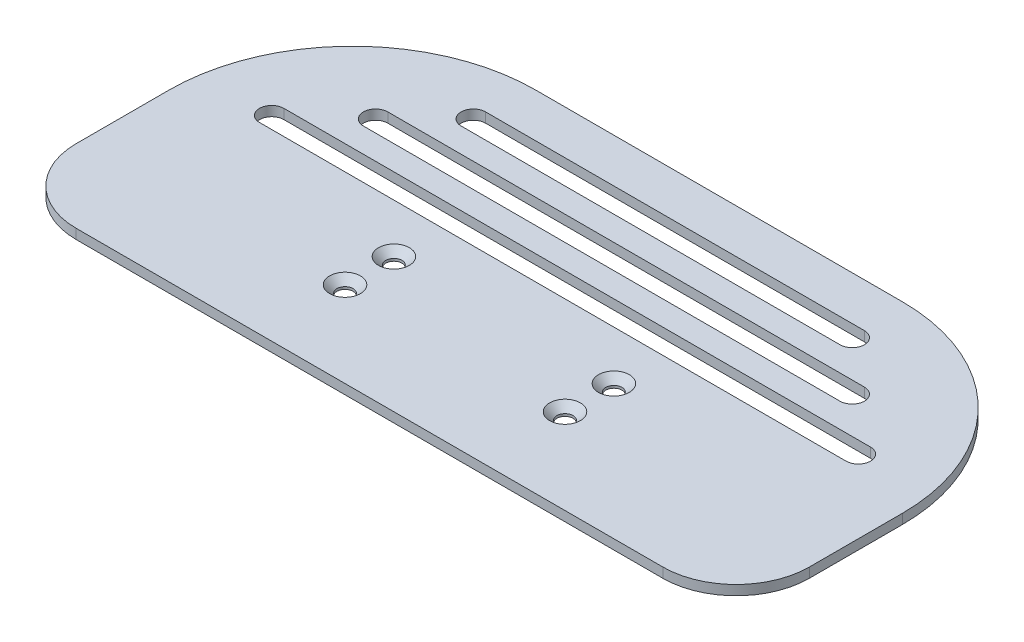
ISO-10303-21;
HEADER;
FILE_DESCRIPTION(('STEP AP214'),'2;1');
FILE_NAME('part.step','',(''),(''),'','','');
FILE_SCHEMA(('AUTOMOTIVE_DESIGN { 1 0 10303 214 1 1 1 1 }'));
ENDSEC;
DATA;
#1=APPLICATION_CONTEXT('core data for automotive mechanical design processes');
#2=APPLICATION_PROTOCOL_DEFINITION('international standard','automotive_design',2000,#1);
#3=PRODUCT_CONTEXT('',#1,'mechanical');
#4=PRODUCT('Part','Part','',(#3));
#5=PRODUCT_RELATED_PRODUCT_CATEGORY('part','',(#4));
#6=PRODUCT_DEFINITION_FORMATION('','',#4);
#7=PRODUCT_DEFINITION_CONTEXT('part definition',#1,'design');
#8=PRODUCT_DEFINITION('design','',#6,#7);
#9=PRODUCT_DEFINITION_SHAPE('','',#8);
#10=(LENGTH_UNIT() NAMED_UNIT(*) SI_UNIT(.MILLI.,.METRE.));
#11=(NAMED_UNIT(*) PLANE_ANGLE_UNIT() SI_UNIT($,.RADIAN.));
#12=(NAMED_UNIT(*) SI_UNIT($,.STERADIAN.) SOLID_ANGLE_UNIT());
#13=UNCERTAINTY_MEASURE_WITH_UNIT(LENGTH_MEASURE(1.E-05),#10,'distance_accuracy_value','');
#14=(GEOMETRIC_REPRESENTATION_CONTEXT(3) GLOBAL_UNCERTAINTY_ASSIGNED_CONTEXT((#13)) GLOBAL_UNIT_ASSIGNED_CONTEXT((#10,
#11,#12)) REPRESENTATION_CONTEXT('',''));
#15=CARTESIAN_POINT('',(0.,0.,0.));
#16=DIRECTION('',(0.,0.,1.));
#17=DIRECTION('',(1.,0.,0.));
#18=AXIS2_PLACEMENT_3D('',#15,#16,#17);
#19=CARTESIAN_POINT('',(45.,2.,16.5));
#20=DIRECTION('',(0.,1.,0.));
#21=DIRECTION('',(0.,0.,1.));
#22=AXIS2_PLACEMENT_3D('',#19,#20,#21);
#23=CONICAL_SURFACE('',#22,6.3,0.785398163397448);
#24=CARTESIAN_POINT('',(45.,-1.,16.5));
#25=DIRECTION('',(0.,1.,0.));
#26=DIRECTION('',(0.,0.,1.));
#27=AXIS2_PLACEMENT_3D('',#24,#25,#26);
#28=CIRCLE('',#27,3.3);
#29=CARTESIAN_POINT('',(45.,-1.,19.8));
#30=VERTEX_POINT('',#29);
#31=EDGE_CURVE('E11',#30,#30,#28,.T.);
#32=ORIENTED_EDGE('',*,*,#31,.F.);
#33=EDGE_LOOP('',(#32));
#34=FACE_BOUND('',#33,.T.);
#35=CARTESIAN_POINT('',(45.,2.,16.5));
#36=DIRECTION('',(0.,1.,0.));
#37=DIRECTION('',(0.,0.,1.));
#38=AXIS2_PLACEMENT_3D('',#35,#36,#37);
#39=CIRCLE('',#38,6.3);
#40=CARTESIAN_POINT('',(45.,2.,22.8));
#41=VERTEX_POINT('',#40);
#42=EDGE_CURVE('E339',#41,#41,#39,.T.);
#43=ORIENTED_EDGE('',*,*,#42,.T.);
#44=EDGE_LOOP('',(#43));
#45=FACE_BOUND('',#44,.T.);
#46=ADVANCED_FACE('F32',(#34,#45),#23,.F.);
#47=CARTESIAN_POINT('',(45.,2.,16.5));
#48=DIRECTION('',(0.,1.,0.));
#49=DIRECTION('',(0.,0.,1.));
#50=AXIS2_PLACEMENT_3D('',#47,#48,#49);
#51=CYLINDRICAL_SURFACE('',#50,3.3);
#52=CARTESIAN_POINT('',(45.,-2.,16.5));
#53=DIRECTION('',(0.,1.,0.));
#54=DIRECTION('',(0.,0.,1.));
#55=AXIS2_PLACEMENT_3D('',#52,#53,#54);
#56=CIRCLE('',#55,3.3);
#57=CARTESIAN_POINT('',(45.,-2.,19.8));
#58=VERTEX_POINT('',#57);
#59=EDGE_CURVE('E39',#58,#58,#56,.T.);
#60=ORIENTED_EDGE('',*,*,#59,.F.);
#61=EDGE_LOOP('',(#60));
#62=FACE_BOUND('',#61,.T.);
#63=ORIENTED_EDGE('',*,*,#31,.T.);
#64=EDGE_LOOP('',(#63));
#65=FACE_BOUND('',#64,.T.);
#66=ADVANCED_FACE('F345',(#62,#65),#51,.F.);
#67=CARTESIAN_POINT('',(-45.,2.,16.5));
#68=DIRECTION('',(0.,1.,0.));
#69=DIRECTION('',(0.,0.,1.));
#70=AXIS2_PLACEMENT_3D('',#67,#68,#69);
#71=CONICAL_SURFACE('',#70,6.3,0.785398163397448);
#72=CARTESIAN_POINT('',(-45.,-1.,16.5));
#73=DIRECTION('',(0.,1.,0.));
#74=DIRECTION('',(0.,0.,1.));
#75=AXIS2_PLACEMENT_3D('',#72,#73,#74);
#76=CIRCLE('',#75,3.3);
#77=CARTESIAN_POINT('',(-45.,-1.,19.8));
#78=VERTEX_POINT('',#77);
#79=EDGE_CURVE('E336',#78,#78,#76,.T.);
#80=ORIENTED_EDGE('',*,*,#79,.F.);
#81=EDGE_LOOP('',(#80));
#82=FACE_BOUND('',#81,.T.);
#83=CARTESIAN_POINT('',(-45.,2.,16.5));
#84=DIRECTION('',(0.,1.,0.));
#85=DIRECTION('',(0.,0.,1.));
#86=AXIS2_PLACEMENT_3D('',#83,#84,#85);
#87=CIRCLE('',#86,6.3);
#88=CARTESIAN_POINT('',(-45.,2.,22.8));
#89=VERTEX_POINT('',#88);
#90=EDGE_CURVE('E330',#89,#89,#87,.T.);
#91=ORIENTED_EDGE('',*,*,#90,.T.);
#92=EDGE_LOOP('',(#91));
#93=FACE_BOUND('',#92,.T.);
#94=ADVANCED_FACE('F348',(#82,#93),#71,.F.);
#95=CARTESIAN_POINT('',(-45.,2.,16.5));
#96=DIRECTION('',(0.,1.,0.));
#97=DIRECTION('',(0.,0.,1.));
#98=AXIS2_PLACEMENT_3D('',#95,#96,#97);
#99=CYLINDRICAL_SURFACE('',#98,3.3);
#100=CARTESIAN_POINT('',(-45.,-2.,16.5));
#101=DIRECTION('',(0.,1.,0.));
#102=DIRECTION('',(0.,0.,1.));
#103=AXIS2_PLACEMENT_3D('',#100,#101,#102);
#104=CIRCLE('',#103,3.3);
#105=CARTESIAN_POINT('',(-45.,-2.,19.8));
#106=VERTEX_POINT('',#105);
#107=EDGE_CURVE('E333',#106,#106,#104,.T.);
#108=ORIENTED_EDGE('',*,*,#107,.F.);
#109=EDGE_LOOP('',(#108));
#110=FACE_BOUND('',#109,.T.);
#111=ORIENTED_EDGE('',*,*,#79,.T.);
#112=EDGE_LOOP('',(#111));
#113=FACE_BOUND('',#112,.T.);
#114=ADVANCED_FACE('F377',(#110,#113),#99,.F.);
#115=CARTESIAN_POINT('',(75.0000000000001,-2.,3.49999999999998));
#116=DIRECTION('',(0.,-1.,0.));
#117=DIRECTION('',(0.,0.,-1.));
#118=AXIS2_PLACEMENT_3D('',#115,#116,#117);
#119=PLANE('',#118);
#120=CARTESIAN_POINT('',(45.,-2.,36.5));
#121=DIRECTION('',(0.,1.,0.));
#122=DIRECTION('',(0.,0.,1.));
#123=AXIS2_PLACEMENT_3D('',#120,#121,#122);
#124=CIRCLE('',#123,3.3);
#125=CARTESIAN_POINT('',(45.,-2.,39.8));
#126=VERTEX_POINT('',#125);
#127=EDGE_CURVE('E634',#126,#126,#124,.T.);
#128=ORIENTED_EDGE('',*,*,#127,.T.);
#129=EDGE_LOOP('',(#128));
#130=FACE_BOUND('',#129,.T.);
#131=CARTESIAN_POINT('',(75.0000000000001,-2.,3.49999999999998));
#132=DIRECTION('',(0.,1.,0.));
#133=DIRECTION('',(0.,0.,-1.));
#134=AXIS2_PLACEMENT_3D('',#131,#132,#133);
#135=CIRCLE('',#134,75.);
#136=CARTESIAN_POINT('',(150.,-2.,3.50000000000049));
#137=VERTEX_POINT('',#136);
#138=CARTESIAN_POINT('',(74.9999999999995,-2.,-71.5));
#139=VERTEX_POINT('',#138);
#140=EDGE_CURVE('E208',#137,#139,#135,.T.);
#141=ORIENTED_EDGE('',*,*,#140,.F.);
#142=DIRECTION('',(0.,0.,-1.));
#143=VECTOR('',#142,1.);
#144=CARTESIAN_POINT('',(150.,-2.,3.50000000000049));
#145=LINE('',#144,#143);
#146=CARTESIAN_POINT('',(150.,-2.,41.4999999999997));
#147=VERTEX_POINT('',#146);
#148=EDGE_CURVE('E277',#147,#137,#145,.T.);
#149=ORIENTED_EDGE('',*,*,#148,.F.);
#150=CARTESIAN_POINT('',(120.,-2.,41.5));
#151=DIRECTION('',(0.,1.,0.));
#152=DIRECTION('',(0.,0.,-1.));
#153=AXIS2_PLACEMENT_3D('',#150,#151,#152);
#154=CIRCLE('',#153,30.);
#155=CARTESIAN_POINT('',(120.,-2.,71.5));
#156=VERTEX_POINT('',#155);
#157=EDGE_CURVE('E304',#156,#147,#154,.T.);
#158=ORIENTED_EDGE('',*,*,#157,.F.);
#159=DIRECTION('',(1.,0.,0.));
#160=VECTOR('',#159,1.);
#161=CARTESIAN_POINT('',(120.,-2.,71.5));
#162=LINE('',#161,#160);
#163=CARTESIAN_POINT('',(-120.,-2.,71.5));
#164=VERTEX_POINT('',#163);
#165=EDGE_CURVE('E302',#164,#156,#162,.T.);
#166=ORIENTED_EDGE('',*,*,#165,.F.);
#167=CARTESIAN_POINT('',(-120.,-2.,41.5));
#168=DIRECTION('',(0.,1.,0.));
#169=DIRECTION('',(0.,0.,-1.));
#170=AXIS2_PLACEMENT_3D('',#167,#168,#169);
#171=CIRCLE('',#170,30.);
#172=CARTESIAN_POINT('',(-150.,-2.,41.4999999999998));
#173=VERTEX_POINT('',#172);
#174=EDGE_CURVE('E300',#173,#164,#171,.T.);
#175=ORIENTED_EDGE('',*,*,#174,.F.);
#176=DIRECTION('',(0.,0.,1.));
#177=VECTOR('',#176,1.);
#178=CARTESIAN_POINT('',(-150.,-2.,3.50000000000053));
#179=LINE('',#178,#177);
#180=CARTESIAN_POINT('',(-150.,-2.,3.50000000000052));
#181=VERTEX_POINT('',#180);
#182=EDGE_CURVE('E298',#181,#173,#179,.T.);
#183=ORIENTED_EDGE('',*,*,#182,.F.);
#184=CARTESIAN_POINT('',(-74.9999999999999,-2.,3.5));
#185=DIRECTION('',(0.,1.,0.));
#186=DIRECTION('',(0.,0.,1.));
#187=AXIS2_PLACEMENT_3D('',#184,#185,#186);
#188=CIRCLE('',#187,75.);
#189=CARTESIAN_POINT('',(-74.9999999999994,-2.,-71.5));
#190=VERTEX_POINT('',#189);
#191=EDGE_CURVE('E296',#190,#181,#188,.T.);
#192=ORIENTED_EDGE('',*,*,#191,.F.);
#193=DIRECTION('',(-1.,0.,0.));
#194=VECTOR('',#193,1.);
#195=CARTESIAN_POINT('',(74.9999999999995,-2.,-71.5));
#196=LINE('',#195,#194);
#197=EDGE_CURVE('E294',#139,#190,#196,.T.);
#198=ORIENTED_EDGE('',*,*,#197,.F.);
#199=EDGE_LOOP('',(#141,#149,#158,#166,#175,#183,#192,#198));
#200=FACE_BOUND('',#199,.T.);
#201=CARTESIAN_POINT('',(-120.,-2.,-8.49999999999989));
#202=DIRECTION('',(0.,1.,0.));
#203=DIRECTION('',(0.,0.,1.));
#204=AXIS2_PLACEMENT_3D('',#201,#202,#203);
#205=CIRCLE('',#204,5.);
#206=CARTESIAN_POINT('',(-120.,-2.,-13.4999999999999));
#207=VERTEX_POINT('',#206);
#208=CARTESIAN_POINT('',(-120.,-2.,-3.49999999999989));
#209=VERTEX_POINT('',#208);
#210=EDGE_CURVE('E242',#207,#209,#205,.T.);
#211=ORIENTED_EDGE('',*,*,#210,.T.);
#212=DIRECTION('',(1.,0.,0.));
#213=VECTOR('',#212,1.);
#214=CARTESIAN_POINT('',(-120.,-2.,-3.49999999999989));
#215=LINE('',#214,#213);
#216=CARTESIAN_POINT('',(120.,-2.,-3.49999999999989));
#217=VERTEX_POINT('',#216);
#218=EDGE_CURVE('E245',#209,#217,#215,.T.);
#219=ORIENTED_EDGE('',*,*,#218,.T.);
#220=CARTESIAN_POINT('',(120.,-2.,-8.49999999999989));
#221=DIRECTION('',(0.,1.,0.));
#222=DIRECTION('',(0.,0.,1.));
#223=AXIS2_PLACEMENT_3D('',#220,#221,#222);
#224=CIRCLE('',#223,5.);
#225=CARTESIAN_POINT('',(120.,-2.,-13.4999999999999));
#226=VERTEX_POINT('',#225);
#227=EDGE_CURVE('E249',#217,#226,#224,.T.);
#228=ORIENTED_EDGE('',*,*,#227,.T.);
#229=DIRECTION('',(-1.,0.,0.));
#230=VECTOR('',#229,1.);
#231=CARTESIAN_POINT('',(-120.,-2.,-13.4999999999999));
#232=LINE('',#231,#230);
#233=EDGE_CURVE('E252',#226,#207,#232,.T.);
#234=ORIENTED_EDGE('',*,*,#233,.T.);
#235=EDGE_LOOP('',(#211,#219,#228,#234));
#236=FACE_BOUND('',#235,.T.);
#237=CARTESIAN_POINT('',(-97.5,-2.,-28.4999999999999));
#238=DIRECTION('',(0.,1.,0.));
#239=DIRECTION('',(0.,0.,1.));
#240=AXIS2_PLACEMENT_3D('',#237,#238,#239);
#241=CIRCLE('',#240,5.00000000000004);
#242=CARTESIAN_POINT('',(-97.5,-2.,-33.5));
#243=VERTEX_POINT('',#242);
#244=CARTESIAN_POINT('',(-97.5,-2.,-23.4999999999999));
#245=VERTEX_POINT('',#244);
#246=EDGE_CURVE('E212',#243,#245,#241,.T.);
#247=ORIENTED_EDGE('',*,*,#246,.T.);
#248=DIRECTION('',(1.,0.,0.));
#249=VECTOR('',#248,1.);
#250=CARTESIAN_POINT('',(-97.5,-2.,-23.4999999999999));
#251=LINE('',#250,#249);
#252=CARTESIAN_POINT('',(97.5,-2.,-23.4999999999999));
#253=VERTEX_POINT('',#252);
#254=EDGE_CURVE('E215',#245,#253,#251,.T.);
#255=ORIENTED_EDGE('',*,*,#254,.T.);
#256=CARTESIAN_POINT('',(97.5,-2.,-28.5));
#257=DIRECTION('',(0.,1.,0.));
#258=DIRECTION('',(0.,0.,1.));
#259=AXIS2_PLACEMENT_3D('',#256,#257,#258);
#260=CIRCLE('',#259,5.00000000000004);
#261=CARTESIAN_POINT('',(97.5,-2.,-33.5));
#262=VERTEX_POINT('',#261);
#263=EDGE_CURVE('E219',#253,#262,#260,.T.);
#264=ORIENTED_EDGE('',*,*,#263,.T.);
#265=DIRECTION('',(-1.,0.,0.));
#266=VECTOR('',#265,1.);
#267=CARTESIAN_POINT('',(-97.5,-2.,-33.5));
#268=LINE('',#267,#266);
#269=EDGE_CURVE('E222',#262,#243,#268,.T.);
#270=ORIENTED_EDGE('',*,*,#269,.T.);
#271=EDGE_LOOP('',(#247,#255,#264,#270));
#272=FACE_BOUND('',#271,.T.);
#273=CARTESIAN_POINT('',(-77.5,-2.,-48.5));
#274=DIRECTION('',(0.,1.,0.));
#275=DIRECTION('',(0.,0.,1.));
#276=AXIS2_PLACEMENT_3D('',#273,#274,#275);
#277=CIRCLE('',#276,5.00000000000002);
#278=CARTESIAN_POINT('',(-77.5,-2.,-53.5));
#279=VERTEX_POINT('',#278);
#280=CARTESIAN_POINT('',(-77.5,-2.,-43.5));
#281=VERTEX_POINT('',#280);
#282=EDGE_CURVE('E170',#279,#281,#277,.T.);
#283=ORIENTED_EDGE('',*,*,#282,.T.);
#284=DIRECTION('',(1.,0.,0.));
#285=VECTOR('',#284,1.);
#286=CARTESIAN_POINT('',(-77.5,-2.,-43.5));
#287=LINE('',#286,#285);
#288=CARTESIAN_POINT('',(77.5,-2.,-43.5));
#289=VERTEX_POINT('',#288);
#290=EDGE_CURVE('E180',#281,#289,#287,.T.);
#291=ORIENTED_EDGE('',*,*,#290,.T.);
#292=CARTESIAN_POINT('',(77.5,-2.,-48.5));
#293=DIRECTION('',(0.,1.,0.));
#294=DIRECTION('',(0.,0.,1.));
#295=AXIS2_PLACEMENT_3D('',#292,#293,#294);
#296=CIRCLE('',#295,5.00000000000002);
#297=CARTESIAN_POINT('',(77.5,-2.,-53.5));
#298=VERTEX_POINT('',#297);
#299=EDGE_CURVE('E184',#289,#298,#296,.T.);
#300=ORIENTED_EDGE('',*,*,#299,.T.);
#301=DIRECTION('',(-1.,0.,0.));
#302=VECTOR('',#301,1.);
#303=CARTESIAN_POINT('',(-77.5,-2.,-53.5));
#304=LINE('',#303,#302);
#305=EDGE_CURVE('E176',#298,#279,#304,.T.);
#306=ORIENTED_EDGE('',*,*,#305,.T.);
#307=EDGE_LOOP('',(#283,#291,#300,#306));
#308=FACE_BOUND('',#307,.T.);
#309=CARTESIAN_POINT('',(-45.,-2.,36.5));
#310=DIRECTION('',(0.,1.,0.));
#311=DIRECTION('',(0.,0.,1.));
#312=AXIS2_PLACEMENT_3D('',#309,#310,#311);
#313=CIRCLE('',#312,3.3);
#314=CARTESIAN_POINT('',(-45.,-2.,39.8));
#315=VERTEX_POINT('',#314);
#316=EDGE_CURVE('E195',#315,#315,#313,.T.);
#317=ORIENTED_EDGE('',*,*,#316,.T.);
#318=EDGE_LOOP('',(#317));
#319=FACE_BOUND('',#318,.T.);
#320=ORIENTED_EDGE('',*,*,#107,.T.);
#321=EDGE_LOOP('',(#320));
#322=FACE_BOUND('',#321,.T.);
#323=ORIENTED_EDGE('',*,*,#59,.T.);
#324=EDGE_LOOP('',(#323));
#325=FACE_BOUND('',#324,.T.);
#326=ADVANCED_FACE('F186',(#130,#200,#236,#272,#308,#319,#322,#325),#119,.T.);
#327=CARTESIAN_POINT('',(75.0000000000001,2.,3.49999999999998));
#328=DIRECTION('',(0.,-1.,0.));
#329=DIRECTION('',(0.,0.,-1.));
#330=AXIS2_PLACEMENT_3D('',#327,#328,#329);
#331=CYLINDRICAL_SURFACE('',#330,75.);
#332=ORIENTED_EDGE('',*,*,#140,.T.);
#333=DIRECTION('',(0.,-1.,0.));
#334=VECTOR('',#333,1.);
#335=CARTESIAN_POINT('',(74.9999999999995,2.,-71.5));
#336=LINE('',#335,#334);
#337=CARTESIAN_POINT('',(74.9999999999995,2.,-71.5));
#338=VERTEX_POINT('',#337);
#339=EDGE_CURVE('E327',#338,#139,#336,.T.);
#340=ORIENTED_EDGE('',*,*,#339,.F.);
#341=CARTESIAN_POINT('',(75.0000000000001,2.,3.49999999999998));
#342=DIRECTION('',(0.,1.,0.));
#343=DIRECTION('',(0.,0.,-1.));
#344=AXIS2_PLACEMENT_3D('',#341,#342,#343);
#345=CIRCLE('',#344,75.);
#346=CARTESIAN_POINT('',(150.,2.,3.50000000000049));
#347=VERTEX_POINT('',#346);
#348=EDGE_CURVE('E273',#347,#338,#345,.T.);
#349=ORIENTED_EDGE('',*,*,#348,.F.);
#350=DIRECTION('',(0.,-1.,0.));
#351=VECTOR('',#350,1.);
#352=CARTESIAN_POINT('',(150.,2.,3.50000000000049));
#353=LINE('',#352,#351);
#354=EDGE_CURVE('E291',#347,#137,#353,.T.);
#355=ORIENTED_EDGE('',*,*,#354,.T.);
#356=EDGE_LOOP('',(#332,#340,#349,#355));
#357=FACE_BOUND('',#356,.T.);
#358=ADVANCED_FACE('F376',(#357),#331,.T.);
#359=CARTESIAN_POINT('',(74.9999999999995,2.,-71.5));
#360=DIRECTION('',(0.,0.,1.));
#361=DIRECTION('',(1.,0.,0.));
#362=AXIS2_PLACEMENT_3D('',#359,#360,#361);
#363=PLANE('',#362);
#364=ORIENTED_EDGE('',*,*,#197,.T.);
#365=DIRECTION('',(0.,-1.,0.));
#366=VECTOR('',#365,1.);
#367=CARTESIAN_POINT('',(-74.9999999999994,2.,-71.5));
#368=LINE('',#367,#366);
#369=CARTESIAN_POINT('',(-74.9999999999994,2.,-71.5));
#370=VERTEX_POINT('',#369);
#371=EDGE_CURVE('E324',#370,#190,#368,.T.);
#372=ORIENTED_EDGE('',*,*,#371,.F.);
#373=DIRECTION('',(-1.,0.,0.));
#374=VECTOR('',#373,1.);
#375=CARTESIAN_POINT('',(74.9999999999995,2.,-71.5));
#376=LINE('',#375,#374);
#377=EDGE_CURVE('E276',#338,#370,#376,.T.);
#378=ORIENTED_EDGE('',*,*,#377,.F.);
#379=ORIENTED_EDGE('',*,*,#339,.T.);
#380=EDGE_LOOP('',(#364,#372,#378,#379));
#381=FACE_BOUND('',#380,.T.);
#382=ADVANCED_FACE('F398',(#381),#363,.F.);
#383=CARTESIAN_POINT('',(-74.9999999999999,2.,3.5));
#384=DIRECTION('',(0.,-1.,0.));
#385=DIRECTION('',(0.,0.,-1.));
#386=AXIS2_PLACEMENT_3D('',#383,#384,#385);
#387=CYLINDRICAL_SURFACE('',#386,75.);
#388=ORIENTED_EDGE('',*,*,#191,.T.);
#389=DIRECTION('',(0.,-1.,0.));
#390=VECTOR('',#389,1.);
#391=CARTESIAN_POINT('',(-150.,2.,3.50000000000052));
#392=LINE('',#391,#390);
#393=CARTESIAN_POINT('',(-150.,2.,3.50000000000052));
#394=VERTEX_POINT('',#393);
#395=EDGE_CURVE('E321',#394,#181,#392,.T.);
#396=ORIENTED_EDGE('',*,*,#395,.F.);
#397=CARTESIAN_POINT('',(-74.9999999999999,2.,3.5));
#398=DIRECTION('',(0.,1.,0.));
#399=DIRECTION('',(0.,0.,1.));
#400=AXIS2_PLACEMENT_3D('',#397,#398,#399);
#401=CIRCLE('',#400,75.);
#402=EDGE_CURVE('E279',#370,#394,#401,.T.);
#403=ORIENTED_EDGE('',*,*,#402,.F.);
#404=ORIENTED_EDGE('',*,*,#371,.T.);
#405=EDGE_LOOP('',(#388,#396,#403,#404));
#406=FACE_BOUND('',#405,.T.);
#407=ADVANCED_FACE('F394',(#406),#387,.T.);
#408=CARTESIAN_POINT('',(-150.,2.,3.50000000000053));
#409=DIRECTION('',(1.,0.,0.));
#410=DIRECTION('',(0.,0.,-1.));
#411=AXIS2_PLACEMENT_3D('',#408,#409,#410);
#412=PLANE('',#411);
#413=ORIENTED_EDGE('',*,*,#182,.T.);
#414=DIRECTION('',(0.,-1.,0.));
#415=VECTOR('',#414,1.);
#416=CARTESIAN_POINT('',(-150.,2.,41.4999999999998));
#417=LINE('',#416,#415);
#418=CARTESIAN_POINT('',(-150.,2.,41.4999999999998));
#419=VERTEX_POINT('',#418);
#420=EDGE_CURVE('E318',#419,#173,#417,.T.);
#421=ORIENTED_EDGE('',*,*,#420,.F.);
#422=DIRECTION('',(0.,0.,1.));
#423=VECTOR('',#422,1.);
#424=CARTESIAN_POINT('',(-150.,2.,3.50000000000053));
#425=LINE('',#424,#423);
#426=EDGE_CURVE('E281',#394,#419,#425,.T.);
#427=ORIENTED_EDGE('',*,*,#426,.F.);
#428=ORIENTED_EDGE('',*,*,#395,.T.);
#429=EDGE_LOOP('',(#413,#421,#427,#428));
#430=FACE_BOUND('',#429,.T.);
#431=ADVANCED_FACE('F390',(#430),#412,.F.);
#432=CARTESIAN_POINT('',(-120.,2.,41.5));
#433=DIRECTION('',(0.,-1.,0.));
#434=DIRECTION('',(0.,0.,-1.));
#435=AXIS2_PLACEMENT_3D('',#432,#433,#434);
#436=CYLINDRICAL_SURFACE('',#435,30.);
#437=ORIENTED_EDGE('',*,*,#174,.T.);
#438=DIRECTION('',(0.,-1.,0.));
#439=VECTOR('',#438,1.);
#440=CARTESIAN_POINT('',(-120.,2.,71.5));
#441=LINE('',#440,#439);
#442=CARTESIAN_POINT('',(-120.,2.,71.5));
#443=VERTEX_POINT('',#442);
#444=EDGE_CURVE('E315',#443,#164,#441,.T.);
#445=ORIENTED_EDGE('',*,*,#444,.F.);
#446=CARTESIAN_POINT('',(-120.,2.,41.5));
#447=DIRECTION('',(0.,1.,0.));
#448=DIRECTION('',(0.,0.,-1.));
#449=AXIS2_PLACEMENT_3D('',#446,#447,#448);
#450=CIRCLE('',#449,30.);
#451=EDGE_CURVE('E283',#419,#443,#450,.T.);
#452=ORIENTED_EDGE('',*,*,#451,.F.);
#453=ORIENTED_EDGE('',*,*,#420,.T.);
#454=EDGE_LOOP('',(#437,#445,#452,#453));
#455=FACE_BOUND('',#454,.T.);
#456=ADVANCED_FACE('F386',(#455),#436,.T.);
#457=CARTESIAN_POINT('',(120.,2.,71.5));
#458=DIRECTION('',(0.,0.,-1.));
#459=DIRECTION('',(-1.,0.,0.));
#460=AXIS2_PLACEMENT_3D('',#457,#458,#459);
#461=PLANE('',#460);
#462=ORIENTED_EDGE('',*,*,#165,.T.);
#463=DIRECTION('',(0.,-1.,0.));
#464=VECTOR('',#463,1.);
#465=CARTESIAN_POINT('',(120.,2.,71.5));
#466=LINE('',#465,#464);
#467=CARTESIAN_POINT('',(120.,2.,71.5));
#468=VERTEX_POINT('',#467);
#469=EDGE_CURVE('E312',#468,#156,#466,.T.);
#470=ORIENTED_EDGE('',*,*,#469,.F.);
#471=DIRECTION('',(1.,0.,0.));
#472=VECTOR('',#471,1.);
#473=CARTESIAN_POINT('',(120.,2.,71.5));
#474=LINE('',#473,#472);
#475=EDGE_CURVE('E285',#443,#468,#474,.T.);
#476=ORIENTED_EDGE('',*,*,#475,.F.);
#477=ORIENTED_EDGE('',*,*,#444,.T.);
#478=EDGE_LOOP('',(#462,#470,#476,#477));
#479=FACE_BOUND('',#478,.T.);
#480=ADVANCED_FACE('F382',(#479),#461,.F.);
#481=CARTESIAN_POINT('',(120.,2.,41.5));
#482=DIRECTION('',(0.,-1.,0.));
#483=DIRECTION('',(0.,0.,-1.));
#484=AXIS2_PLACEMENT_3D('',#481,#482,#483);
#485=CYLINDRICAL_SURFACE('',#484,30.);
#486=ORIENTED_EDGE('',*,*,#157,.T.);
#487=DIRECTION('',(0.,-1.,0.));
#488=VECTOR('',#487,1.);
#489=CARTESIAN_POINT('',(150.,2.,41.4999999999997));
#490=LINE('',#489,#488);
#491=CARTESIAN_POINT('',(150.,2.,41.4999999999997));
#492=VERTEX_POINT('',#491);
#493=EDGE_CURVE('E309',#492,#147,#490,.T.);
#494=ORIENTED_EDGE('',*,*,#493,.F.);
#495=CARTESIAN_POINT('',(120.,2.,41.5));
#496=DIRECTION('',(0.,1.,0.));
#497=DIRECTION('',(0.,0.,-1.));
#498=AXIS2_PLACEMENT_3D('',#495,#496,#497);
#499=CIRCLE('',#498,30.);
#500=EDGE_CURVE('E287',#468,#492,#499,.T.);
#501=ORIENTED_EDGE('',*,*,#500,.F.);
#502=ORIENTED_EDGE('',*,*,#469,.T.);
#503=EDGE_LOOP('',(#486,#494,#501,#502));
#504=FACE_BOUND('',#503,.T.);
#505=ADVANCED_FACE('F368',(#504),#485,.T.);
#506=CARTESIAN_POINT('',(150.,2.,3.50000000000049));
#507=DIRECTION('',(-1.,0.,0.));
#508=DIRECTION('',(0.,0.,1.));
#509=AXIS2_PLACEMENT_3D('',#506,#507,#508);
#510=PLANE('',#509);
#511=ORIENTED_EDGE('',*,*,#148,.T.);
#512=ORIENTED_EDGE('',*,*,#354,.F.);
#513=DIRECTION('',(0.,0.,-1.));
#514=VECTOR('',#513,1.);
#515=CARTESIAN_POINT('',(150.,2.,3.50000000000049));
#516=LINE('',#515,#514);
#517=EDGE_CURVE('E289',#492,#347,#516,.T.);
#518=ORIENTED_EDGE('',*,*,#517,.F.);
#519=ORIENTED_EDGE('',*,*,#493,.T.);
#520=EDGE_LOOP('',(#511,#512,#518,#519));
#521=FACE_BOUND('',#520,.T.);
#522=ADVANCED_FACE('F358',(#521),#510,.F.);
#523=CARTESIAN_POINT('',(75.0000000000001,2.,3.49999999999998));
#524=DIRECTION('',(0.,-1.,0.));
#525=DIRECTION('',(0.,0.,-1.));
#526=AXIS2_PLACEMENT_3D('',#523,#524,#525);
#527=PLANE('',#526);
#528=CARTESIAN_POINT('',(45.,2.,36.5));
#529=DIRECTION('',(0.,1.,0.));
#530=DIRECTION('',(0.,0.,1.));
#531=AXIS2_PLACEMENT_3D('',#528,#529,#530);
#532=CIRCLE('',#531,6.3);
#533=CARTESIAN_POINT('',(45.,2.,42.8));
#534=VERTEX_POINT('',#533);
#535=EDGE_CURVE('E633',#534,#534,#532,.T.);
#536=ORIENTED_EDGE('',*,*,#535,.F.);
#537=EDGE_LOOP('',(#536));
#538=FACE_BOUND('',#537,.T.);
#539=CARTESIAN_POINT('',(-45.,2.,36.5));
#540=DIRECTION('',(0.,1.,0.));
#541=DIRECTION('',(0.,0.,1.));
#542=AXIS2_PLACEMENT_3D('',#539,#540,#541);
#543=CIRCLE('',#542,6.3);
#544=CARTESIAN_POINT('',(-45.,2.,42.8));
#545=VERTEX_POINT('',#544);
#546=EDGE_CURVE('E640',#545,#545,#543,.T.);
#547=ORIENTED_EDGE('',*,*,#546,.F.);
#548=EDGE_LOOP('',(#547));
#549=FACE_BOUND('',#548,.T.);
#550=DIRECTION('',(1.,0.,0.));
#551=VECTOR('',#550,1.);
#552=CARTESIAN_POINT('',(-77.5,2.,-43.5));
#553=LINE('',#552,#551);
#554=CARTESIAN_POINT('',(-77.5,2.,-43.5));
#555=VERTEX_POINT('',#554);
#556=CARTESIAN_POINT('',(77.5,2.,-43.5));
#557=VERTEX_POINT('',#556);
#558=EDGE_CURVE('E201',#555,#557,#553,.T.);
#559=ORIENTED_EDGE('',*,*,#558,.F.);
#560=CARTESIAN_POINT('',(-77.5,2.,-48.5));
#561=DIRECTION('',(0.,1.,0.));
#562=DIRECTION('',(0.,0.,1.));
#563=AXIS2_PLACEMENT_3D('',#560,#561,#562);
#564=CIRCLE('',#563,5.00000000000002);
#565=CARTESIAN_POINT('',(-77.5,2.,-53.5));
#566=VERTEX_POINT('',#565);
#567=EDGE_CURVE('E46',#566,#555,#564,.T.);
#568=ORIENTED_EDGE('',*,*,#567,.F.);
#569=DIRECTION('',(-1.,0.,0.));
#570=VECTOR('',#569,1.);
#571=CARTESIAN_POINT('',(-77.5,2.,-53.5));
#572=LINE('',#571,#570);
#573=CARTESIAN_POINT('',(77.5,2.,-53.5));
#574=VERTEX_POINT('',#573);
#575=EDGE_CURVE('E189',#574,#566,#572,.T.);
#576=ORIENTED_EDGE('',*,*,#575,.F.);
#577=CARTESIAN_POINT('',(77.5,2.,-48.5));
#578=DIRECTION('',(0.,1.,0.));
#579=DIRECTION('',(0.,0.,1.));
#580=AXIS2_PLACEMENT_3D('',#577,#578,#579);
#581=CIRCLE('',#580,5.00000000000002);
#582=EDGE_CURVE('E192',#557,#574,#581,.T.);
#583=ORIENTED_EDGE('',*,*,#582,.F.);
#584=EDGE_LOOP('',(#559,#568,#576,#583));
#585=FACE_BOUND('',#584,.T.);
#586=DIRECTION('',(1.,0.,0.));
#587=VECTOR('',#586,1.);
#588=CARTESIAN_POINT('',(-97.5,2.,-23.4999999999999));
#589=LINE('',#588,#587);
#590=CARTESIAN_POINT('',(-97.5,2.,-23.4999999999999));
#591=VERTEX_POINT('',#590);
#592=CARTESIAN_POINT('',(97.5,2.,-23.4999999999999));
#593=VERTEX_POINT('',#592);
#594=EDGE_CURVE('E227',#591,#593,#589,.T.);
#595=ORIENTED_EDGE('',*,*,#594,.F.);
#596=CARTESIAN_POINT('',(-97.5,2.,-28.4999999999999));
#597=DIRECTION('',(0.,1.,0.));
#598=DIRECTION('',(0.,0.,1.));
#599=AXIS2_PLACEMENT_3D('',#596,#597,#598);
#600=CIRCLE('',#599,5.00000000000004);
#601=CARTESIAN_POINT('',(-97.5,2.,-33.5));
#602=VERTEX_POINT('',#601);
#603=EDGE_CURVE('E54',#602,#591,#600,.T.);
#604=ORIENTED_EDGE('',*,*,#603,.F.);
#605=DIRECTION('',(-1.,0.,0.));
#606=VECTOR('',#605,1.);
#607=CARTESIAN_POINT('',(-97.5,2.,-33.5));
#608=LINE('',#607,#606);
#609=CARTESIAN_POINT('',(97.5,2.,-33.5));
#610=VERTEX_POINT('',#609);
#611=EDGE_CURVE('E216',#610,#602,#608,.T.);
#612=ORIENTED_EDGE('',*,*,#611,.F.);
#613=CARTESIAN_POINT('',(97.5,2.,-28.5));
#614=DIRECTION('',(0.,1.,0.));
#615=DIRECTION('',(0.,0.,1.));
#616=AXIS2_PLACEMENT_3D('',#613,#614,#615);
#617=CIRCLE('',#616,5.00000000000004);
#618=EDGE_CURVE('E231',#593,#610,#617,.T.);
#619=ORIENTED_EDGE('',*,*,#618,.F.);
#620=EDGE_LOOP('',(#595,#604,#612,#619));
#621=FACE_BOUND('',#620,.T.);
#622=DIRECTION('',(1.,0.,0.));
#623=VECTOR('',#622,1.);
#624=CARTESIAN_POINT('',(-120.,2.,-3.49999999999989));
#625=LINE('',#624,#623);
#626=CARTESIAN_POINT('',(-120.,2.,-3.49999999999989));
#627=VERTEX_POINT('',#626);
#628=CARTESIAN_POINT('',(120.,2.,-3.49999999999989));
#629=VERTEX_POINT('',#628);
#630=EDGE_CURVE('E258',#627,#629,#625,.T.);
#631=ORIENTED_EDGE('',*,*,#630,.F.);
#632=CARTESIAN_POINT('',(-120.,2.,-8.49999999999989));
#633=DIRECTION('',(0.,1.,0.));
#634=DIRECTION('',(0.,0.,1.));
#635=AXIS2_PLACEMENT_3D('',#632,#633,#634);
#636=CIRCLE('',#635,5.);
#637=CARTESIAN_POINT('',(-120.,2.,-13.4999999999999));
#638=VERTEX_POINT('',#637);
#639=EDGE_CURVE('E256',#638,#627,#636,.T.);
#640=ORIENTED_EDGE('',*,*,#639,.F.);
#641=DIRECTION('',(-1.,0.,0.));
#642=VECTOR('',#641,1.);
#643=CARTESIAN_POINT('',(-120.,2.,-13.4999999999999));
#644=LINE('',#643,#642);
#645=CARTESIAN_POINT('',(120.,2.,-13.4999999999999));
#646=VERTEX_POINT('',#645);
#647=EDGE_CURVE('E246',#646,#638,#644,.T.);
#648=ORIENTED_EDGE('',*,*,#647,.F.);
#649=CARTESIAN_POINT('',(120.,2.,-8.49999999999989));
#650=DIRECTION('',(0.,1.,0.));
#651=DIRECTION('',(0.,0.,1.));
#652=AXIS2_PLACEMENT_3D('',#649,#650,#651);
#653=CIRCLE('',#652,5.);
#654=EDGE_CURVE('E261',#629,#646,#653,.T.);
#655=ORIENTED_EDGE('',*,*,#654,.F.);
#656=EDGE_LOOP('',(#631,#640,#648,#655));
#657=FACE_BOUND('',#656,.T.);
#658=ORIENTED_EDGE('',*,*,#348,.T.);
#659=ORIENTED_EDGE('',*,*,#377,.T.);
#660=ORIENTED_EDGE('',*,*,#402,.T.);
#661=ORIENTED_EDGE('',*,*,#426,.T.);
#662=ORIENTED_EDGE('',*,*,#451,.T.);
#663=ORIENTED_EDGE('',*,*,#475,.T.);
#664=ORIENTED_EDGE('',*,*,#500,.T.);
#665=ORIENTED_EDGE('',*,*,#517,.T.);
#666=EDGE_LOOP('',(#658,#659,#660,#661,#662,#663,#664,#665));
#667=FACE_BOUND('',#666,.T.);
#668=ORIENTED_EDGE('',*,*,#90,.F.);
#669=EDGE_LOOP('',(#668));
#670=FACE_BOUND('',#669,.T.);
#671=ORIENTED_EDGE('',*,*,#42,.F.);
#672=EDGE_LOOP('',(#671));
#673=FACE_BOUND('',#672,.T.);
#674=ADVANCED_FACE('F355',(#538,#549,#585,#621,#657,#667,#670,#673),#527,.F.);
#675=CARTESIAN_POINT('',(-120.,-2.,-8.49999999999989));
#676=DIRECTION('',(0.,1.,0.));
#677=DIRECTION('',(0.,0.,1.));
#678=AXIS2_PLACEMENT_3D('',#675,#676,#677);
#679=CYLINDRICAL_SURFACE('',#678,5.);
#680=ORIENTED_EDGE('',*,*,#639,.T.);
#681=DIRECTION('',(0.,1.,0.));
#682=VECTOR('',#681,1.);
#683=CARTESIAN_POINT('',(-120.,-2.,-3.49999999999989));
#684=LINE('',#683,#682);
#685=EDGE_CURVE('E255',#209,#627,#684,.T.);
#686=ORIENTED_EDGE('',*,*,#685,.F.);
#687=ORIENTED_EDGE('',*,*,#210,.F.);
#688=DIRECTION('',(0.,1.,0.));
#689=VECTOR('',#688,1.);
#690=CARTESIAN_POINT('',(-120.,-2.,-13.4999999999999));
#691=LINE('',#690,#689);
#692=EDGE_CURVE('E228',#207,#638,#691,.T.);
#693=ORIENTED_EDGE('',*,*,#692,.T.);
#694=EDGE_LOOP('',(#680,#686,#687,#693));
#695=FACE_BOUND('',#694,.T.);
#696=ADVANCED_FACE('F357',(#695),#679,.F.);
#697=CARTESIAN_POINT('',(-120.,-2.,-13.4999999999999));
#698=DIRECTION('',(0.,0.,-1.));
#699=DIRECTION('',(-1.,0.,0.));
#700=AXIS2_PLACEMENT_3D('',#697,#698,#699);
#701=PLANE('',#700);
#702=ORIENTED_EDGE('',*,*,#647,.T.);
#703=ORIENTED_EDGE('',*,*,#692,.F.);
#704=ORIENTED_EDGE('',*,*,#233,.F.);
#705=DIRECTION('',(0.,1.,0.));
#706=VECTOR('',#705,1.);
#707=CARTESIAN_POINT('',(120.,-2.,-13.4999999999999));
#708=LINE('',#707,#706);
#709=EDGE_CURVE('E267',#226,#646,#708,.T.);
#710=ORIENTED_EDGE('',*,*,#709,.T.);
#711=EDGE_LOOP('',(#702,#703,#704,#710));
#712=FACE_BOUND('',#711,.T.);
#713=ADVANCED_FACE('F365',(#712),#701,.F.);
#714=CARTESIAN_POINT('',(120.,-2.,-8.49999999999989));
#715=DIRECTION('',(0.,1.,0.));
#716=DIRECTION('',(0.,0.,1.));
#717=AXIS2_PLACEMENT_3D('',#714,#715,#716);
#718=CYLINDRICAL_SURFACE('',#717,5.);
#719=ORIENTED_EDGE('',*,*,#654,.T.);
#720=ORIENTED_EDGE('',*,*,#709,.F.);
#721=ORIENTED_EDGE('',*,*,#227,.F.);
#722=DIRECTION('',(0.,1.,0.));
#723=VECTOR('',#722,1.);
#724=CARTESIAN_POINT('',(120.,-2.,-3.49999999999989));
#725=LINE('',#724,#723);
#726=EDGE_CURVE('E269',#217,#629,#725,.T.);
#727=ORIENTED_EDGE('',*,*,#726,.T.);
#728=EDGE_LOOP('',(#719,#720,#721,#727));
#729=FACE_BOUND('',#728,.T.);
#730=ADVANCED_FACE('F476',(#729),#718,.F.);
#731=CARTESIAN_POINT('',(-120.,-2.,-3.49999999999989));
#732=DIRECTION('',(0.,0.,1.));
#733=DIRECTION('',(1.,0.,0.));
#734=AXIS2_PLACEMENT_3D('',#731,#732,#733);
#735=PLANE('',#734);
#736=ORIENTED_EDGE('',*,*,#630,.T.);
#737=ORIENTED_EDGE('',*,*,#726,.F.);
#738=ORIENTED_EDGE('',*,*,#218,.F.);
#739=ORIENTED_EDGE('',*,*,#685,.T.);
#740=EDGE_LOOP('',(#736,#737,#738,#739));
#741=FACE_BOUND('',#740,.T.);
#742=ADVANCED_FACE('F486',(#741),#735,.F.);
#743=CARTESIAN_POINT('',(-97.5,-2.,-28.4999999999999));
#744=DIRECTION('',(0.,1.,0.));
#745=DIRECTION('',(0.,0.,1.));
#746=AXIS2_PLACEMENT_3D('',#743,#744,#745);
#747=CYLINDRICAL_SURFACE('',#746,5.00000000000004);
#748=ORIENTED_EDGE('',*,*,#603,.T.);
#749=DIRECTION('',(0.,1.,0.));
#750=VECTOR('',#749,1.);
#751=CARTESIAN_POINT('',(-97.5,-2.,-23.4999999999999));
#752=LINE('',#751,#750);
#753=EDGE_CURVE('E225',#245,#591,#752,.T.);
#754=ORIENTED_EDGE('',*,*,#753,.F.);
#755=ORIENTED_EDGE('',*,*,#246,.F.);
#756=DIRECTION('',(0.,1.,0.));
#757=VECTOR('',#756,1.);
#758=CARTESIAN_POINT('',(-97.5,-2.,-33.5));
#759=LINE('',#758,#757);
#760=EDGE_CURVE('E202',#243,#602,#759,.T.);
#761=ORIENTED_EDGE('',*,*,#760,.T.);
#762=EDGE_LOOP('',(#748,#754,#755,#761));
#763=FACE_BOUND('',#762,.T.);
#764=ADVANCED_FACE('F496',(#763),#747,.F.);
#765=CARTESIAN_POINT('',(-97.5,-2.,-33.5));
#766=DIRECTION('',(0.,0.,-1.));
#767=DIRECTION('',(-1.,0.,0.));
#768=AXIS2_PLACEMENT_3D('',#765,#766,#767);
#769=PLANE('',#768);
#770=ORIENTED_EDGE('',*,*,#611,.T.);
#771=ORIENTED_EDGE('',*,*,#760,.F.);
#772=ORIENTED_EDGE('',*,*,#269,.F.);
#773=DIRECTION('',(0.,1.,0.));
#774=VECTOR('',#773,1.);
#775=CARTESIAN_POINT('',(97.5,-2.,-33.5));
#776=LINE('',#775,#774);
#777=EDGE_CURVE('E237',#262,#610,#776,.T.);
#778=ORIENTED_EDGE('',*,*,#777,.T.);
#779=EDGE_LOOP('',(#770,#771,#772,#778));
#780=FACE_BOUND('',#779,.T.);
#781=ADVANCED_FACE('F505',(#780),#769,.F.);
#782=CARTESIAN_POINT('',(97.5,-2.,-28.5));
#783=DIRECTION('',(0.,1.,0.));
#784=DIRECTION('',(0.,0.,1.));
#785=AXIS2_PLACEMENT_3D('',#782,#783,#784);
#786=CYLINDRICAL_SURFACE('',#785,5.00000000000004);
#787=ORIENTED_EDGE('',*,*,#618,.T.);
#788=ORIENTED_EDGE('',*,*,#777,.F.);
#789=ORIENTED_EDGE('',*,*,#263,.F.);
#790=DIRECTION('',(0.,1.,0.));
#791=VECTOR('',#790,1.);
#792=CARTESIAN_POINT('',(97.5,-2.,-23.4999999999999));
#793=LINE('',#792,#791);
#794=EDGE_CURVE('E239',#253,#593,#793,.T.);
#795=ORIENTED_EDGE('',*,*,#794,.T.);
#796=EDGE_LOOP('',(#787,#788,#789,#795));
#797=FACE_BOUND('',#796,.T.);
#798=ADVANCED_FACE('F514',(#797),#786,.F.);
#799=CARTESIAN_POINT('',(-97.5,-2.,-23.4999999999999));
#800=DIRECTION('',(0.,0.,1.));
#801=DIRECTION('',(1.,0.,0.));
#802=AXIS2_PLACEMENT_3D('',#799,#800,#801);
#803=PLANE('',#802);
#804=ORIENTED_EDGE('',*,*,#594,.T.);
#805=ORIENTED_EDGE('',*,*,#794,.F.);
#806=ORIENTED_EDGE('',*,*,#254,.F.);
#807=ORIENTED_EDGE('',*,*,#753,.T.);
#808=EDGE_LOOP('',(#804,#805,#806,#807));
#809=FACE_BOUND('',#808,.T.);
#810=ADVANCED_FACE('F524',(#809),#803,.F.);
#811=CARTESIAN_POINT('',(-77.5,-2.,-48.5));
#812=DIRECTION('',(0.,1.,0.));
#813=DIRECTION('',(0.,0.,1.));
#814=AXIS2_PLACEMENT_3D('',#811,#812,#813);
#815=CYLINDRICAL_SURFACE('',#814,5.00000000000002);
#816=ORIENTED_EDGE('',*,*,#567,.T.);
#817=DIRECTION('',(0.,1.,0.));
#818=VECTOR('',#817,1.);
#819=CARTESIAN_POINT('',(-77.5,-2.,-43.5));
#820=LINE('',#819,#818);
#821=EDGE_CURVE('E166',#281,#555,#820,.T.);
#822=ORIENTED_EDGE('',*,*,#821,.F.);
#823=ORIENTED_EDGE('',*,*,#282,.F.);
#824=DIRECTION('',(0.,1.,0.));
#825=VECTOR('',#824,1.);
#826=CARTESIAN_POINT('',(-77.5,-2.,-53.5));
#827=LINE('',#826,#825);
#828=EDGE_CURVE('E206',#279,#566,#827,.T.);
#829=ORIENTED_EDGE('',*,*,#828,.T.);
#830=EDGE_LOOP('',(#816,#822,#823,#829));
#831=FACE_BOUND('',#830,.T.);
#832=ADVANCED_FACE('F168',(#831),#815,.F.);
#833=CARTESIAN_POINT('',(-77.5,-2.,-53.5));
#834=DIRECTION('',(0.,0.,-1.));
#835=DIRECTION('',(-1.,0.,0.));
#836=AXIS2_PLACEMENT_3D('',#833,#834,#835);
#837=PLANE('',#836);
#838=ORIENTED_EDGE('',*,*,#575,.T.);
#839=ORIENTED_EDGE('',*,*,#828,.F.);
#840=ORIENTED_EDGE('',*,*,#305,.F.);
#841=DIRECTION('',(0.,1.,0.));
#842=VECTOR('',#841,1.);
#843=CARTESIAN_POINT('',(77.5,-2.,-53.5));
#844=LINE('',#843,#842);
#845=EDGE_CURVE('E209',#298,#574,#844,.T.);
#846=ORIENTED_EDGE('',*,*,#845,.T.);
#847=EDGE_LOOP('',(#838,#839,#840,#846));
#848=FACE_BOUND('',#847,.T.);
#849=ADVANCED_FACE('F543',(#848),#837,.F.);
#850=CARTESIAN_POINT('',(77.5,-2.,-48.5));
#851=DIRECTION('',(0.,1.,0.));
#852=DIRECTION('',(0.,0.,1.));
#853=AXIS2_PLACEMENT_3D('',#850,#851,#852);
#854=CYLINDRICAL_SURFACE('',#853,5.00000000000002);
#855=ORIENTED_EDGE('',*,*,#582,.T.);
#856=ORIENTED_EDGE('',*,*,#845,.F.);
#857=ORIENTED_EDGE('',*,*,#299,.F.);
#858=DIRECTION('',(0.,1.,0.));
#859=VECTOR('',#858,1.);
#860=CARTESIAN_POINT('',(77.5,-2.,-43.5));
#861=LINE('',#860,#859);
#862=EDGE_CURVE('E175',#289,#557,#861,.T.);
#863=ORIENTED_EDGE('',*,*,#862,.T.);
#864=EDGE_LOOP('',(#855,#856,#857,#863));
#865=FACE_BOUND('',#864,.T.);
#866=ADVANCED_FACE('F552',(#865),#854,.F.);
#867=CARTESIAN_POINT('',(-77.5,-2.,-43.5));
#868=DIRECTION('',(0.,0.,1.));
#869=DIRECTION('',(1.,0.,0.));
#870=AXIS2_PLACEMENT_3D('',#867,#868,#869);
#871=PLANE('',#870);
#872=ORIENTED_EDGE('',*,*,#558,.T.);
#873=ORIENTED_EDGE('',*,*,#862,.F.);
#874=ORIENTED_EDGE('',*,*,#290,.F.);
#875=ORIENTED_EDGE('',*,*,#821,.T.);
#876=EDGE_LOOP('',(#872,#873,#874,#875));
#877=FACE_BOUND('',#876,.T.);
#878=ADVANCED_FACE('F181',(#877),#871,.F.);
#879=CARTESIAN_POINT('',(-45.,2.,36.5));
#880=DIRECTION('',(0.,1.,0.));
#881=DIRECTION('',(0.,0.,1.));
#882=AXIS2_PLACEMENT_3D('',#879,#880,#881);
#883=CYLINDRICAL_SURFACE('',#882,3.3);
#884=ORIENTED_EDGE('',*,*,#316,.F.);
#885=EDGE_LOOP('',(#884));
#886=FACE_BOUND('',#885,.T.);
#887=CARTESIAN_POINT('',(-45.,-1.,36.5));
#888=DIRECTION('',(0.,1.,0.));
#889=DIRECTION('',(0.,0.,1.));
#890=AXIS2_PLACEMENT_3D('',#887,#888,#889);
#891=CIRCLE('',#890,3.3);
#892=CARTESIAN_POINT('',(-45.,-1.,39.8));
#893=VERTEX_POINT('',#892);
#894=EDGE_CURVE('E642',#893,#893,#891,.T.);
#895=ORIENTED_EDGE('',*,*,#894,.T.);
#896=EDGE_LOOP('',(#895));
#897=FACE_BOUND('',#896,.T.);
#898=ADVANCED_FACE('F571',(#886,#897),#883,.F.);
#899=CARTESIAN_POINT('',(-45.,2.,36.5));
#900=DIRECTION('',(0.,1.,0.));
#901=DIRECTION('',(0.,0.,1.));
#902=AXIS2_PLACEMENT_3D('',#899,#900,#901);
#903=CONICAL_SURFACE('',#902,6.3,0.785398163397448);
#904=ORIENTED_EDGE('',*,*,#894,.F.);
#905=EDGE_LOOP('',(#904));
#906=FACE_BOUND('',#905,.T.);
#907=ORIENTED_EDGE('',*,*,#546,.T.);
#908=EDGE_LOOP('',(#907));
#909=FACE_BOUND('',#908,.T.);
#910=ADVANCED_FACE('F580',(#906,#909),#903,.F.);
#911=CARTESIAN_POINT('',(45.,2.,36.5));
#912=DIRECTION('',(0.,1.,0.));
#913=DIRECTION('',(0.,0.,1.));
#914=AXIS2_PLACEMENT_3D('',#911,#912,#913);
#915=CYLINDRICAL_SURFACE('',#914,3.3);
#916=ORIENTED_EDGE('',*,*,#127,.F.);
#917=EDGE_LOOP('',(#916));
#918=FACE_BOUND('',#917,.T.);
#919=CARTESIAN_POINT('',(45.,-1.,36.5));
#920=DIRECTION('',(0.,1.,0.));
#921=DIRECTION('',(0.,0.,1.));
#922=AXIS2_PLACEMENT_3D('',#919,#920,#921);
#923=CIRCLE('',#922,3.3);
#924=CARTESIAN_POINT('',(45.,-1.,39.8));
#925=VERTEX_POINT('',#924);
#926=EDGE_CURVE('E631',#925,#925,#923,.T.);
#927=ORIENTED_EDGE('',*,*,#926,.T.);
#928=EDGE_LOOP('',(#927));
#929=FACE_BOUND('',#928,.T.);
#930=ADVANCED_FACE('F590',(#918,#929),#915,.F.);
#931=CARTESIAN_POINT('',(45.,2.,36.5));
#932=DIRECTION('',(0.,1.,0.));
#933=DIRECTION('',(0.,0.,1.));
#934=AXIS2_PLACEMENT_3D('',#931,#932,#933);
#935=CONICAL_SURFACE('',#934,6.3,0.785398163397448);
#936=ORIENTED_EDGE('',*,*,#926,.F.);
#937=EDGE_LOOP('',(#936));
#938=FACE_BOUND('',#937,.T.);
#939=ORIENTED_EDGE('',*,*,#535,.T.);
#940=EDGE_LOOP('',(#939));
#941=FACE_BOUND('',#940,.T.);
#942=ADVANCED_FACE('F615',(#938,#941),#935,.F.);
#943=CLOSED_SHELL('',(#46,#66,#94,#114,#326,#358,#382,#407,#431,#456,#480,#505,#522,#674,#696,
#713,#730,#742,#764,#781,#798,#810,#832,#849,#866,#878,#898,#910,#930,#942));
#944=MANIFOLD_SOLID_BREP('B2',#943);
#945=ADVANCED_BREP_SHAPE_REPRESENTATION('',(#18,#944),#14);
#946=SHAPE_DEFINITION_REPRESENTATION(#9,#945);
ENDSEC;
END-ISO-10303-21;
